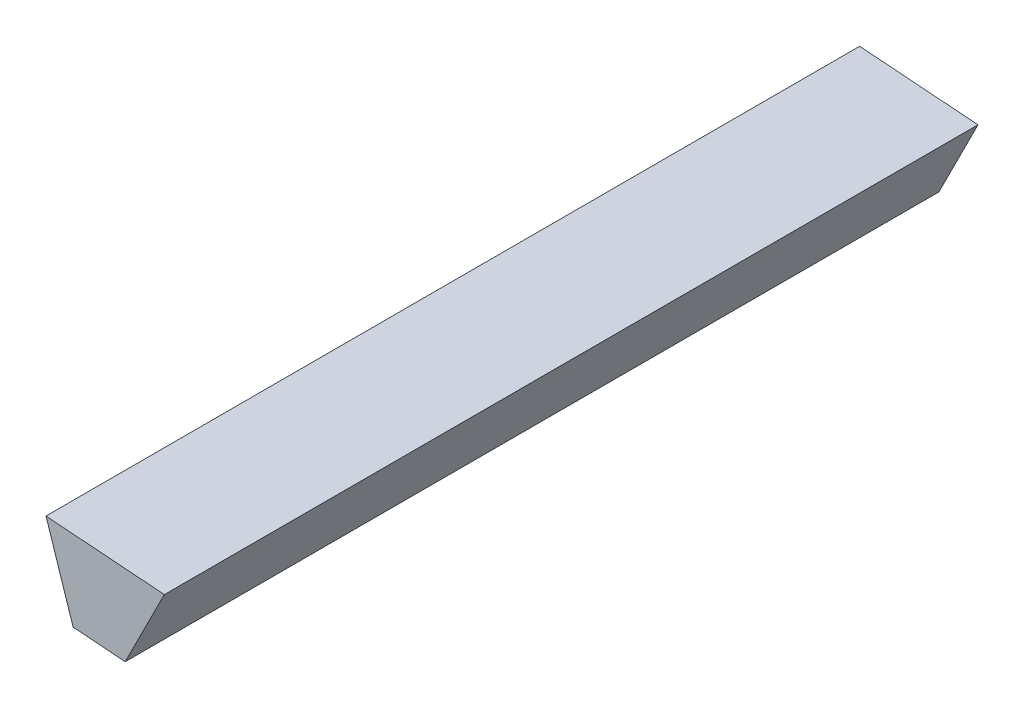
ISO-10303-21;
HEADER;
FILE_DESCRIPTION(('STEP AP214'),'2;1');
FILE_NAME('part.step','',(''),(''),'','','');
FILE_SCHEMA(('AUTOMOTIVE_DESIGN { 1 0 10303 214 1 1 1 1 }'));
ENDSEC;
DATA;
#1=APPLICATION_CONTEXT('core data for automotive mechanical design processes');
#2=APPLICATION_PROTOCOL_DEFINITION('international standard','automotive_design',2000,#1);
#3=PRODUCT_CONTEXT('',#1,'mechanical');
#4=PRODUCT('Part','Part','',(#3));
#5=PRODUCT_RELATED_PRODUCT_CATEGORY('part','',(#4));
#6=PRODUCT_DEFINITION_FORMATION('','',#4);
#7=PRODUCT_DEFINITION_CONTEXT('part definition',#1,'design');
#8=PRODUCT_DEFINITION('design','',#6,#7);
#9=PRODUCT_DEFINITION_SHAPE('','',#8);
#10=(LENGTH_UNIT() NAMED_UNIT(*) SI_UNIT(.MILLI.,.METRE.));
#11=(NAMED_UNIT(*) PLANE_ANGLE_UNIT() SI_UNIT($,.RADIAN.));
#12=(NAMED_UNIT(*) SI_UNIT($,.STERADIAN.) SOLID_ANGLE_UNIT());
#13=UNCERTAINTY_MEASURE_WITH_UNIT(LENGTH_MEASURE(1.E-05),#10,'distance_accuracy_value','');
#14=(GEOMETRIC_REPRESENTATION_CONTEXT(3) GLOBAL_UNCERTAINTY_ASSIGNED_CONTEXT((#13)) GLOBAL_UNIT_ASSIGNED_CONTEXT((#10,
#11,#12)) REPRESENTATION_CONTEXT('',''));
#15=CARTESIAN_POINT('',(0.,0.,0.));
#16=DIRECTION('',(0.,0.,1.));
#17=DIRECTION('',(1.,0.,0.));
#18=AXIS2_PLACEMENT_3D('',#15,#16,#17);
#19=CARTESIAN_POINT('',(3.,52.9150262212918,15.));
#20=DIRECTION('',(0.950206795615849,0.311620033960367,0.));
#21=DIRECTION('',(-0.311620033960367,0.950206795615849,0.));
#22=AXIS2_PLACEMENT_3D('',#19,#20,#21);
#23=PLANE('',#22);
#24=DIRECTION('',(0.311620033960367,-0.950206795615849,0.));
#25=VECTOR('',#24,1.);
#26=CARTESIAN_POINT('',(3.,52.9150262212918,-15.));
#27=LINE('',#26,#25);
#28=CARTESIAN_POINT('',(2.,55.9642743185329,-15.));
#29=VERTEX_POINT('',#28);
#30=CARTESIAN_POINT('',(3.,52.9150262212918,-15.));
#31=VERTEX_POINT('',#30);
#32=EDGE_CURVE('E107',#29,#31,#27,.T.);
#33=ORIENTED_EDGE('',*,*,#32,.T.);
#34=DIRECTION('',(0.,0.,-1.));
#35=VECTOR('',#34,1.);
#36=CARTESIAN_POINT('',(3.,52.9150262212918,15.));
#37=LINE('',#36,#35);
#38=CARTESIAN_POINT('',(3.,52.9150262212918,15.));
#39=VERTEX_POINT('',#38);
#40=EDGE_CURVE('E11',#39,#31,#37,.T.);
#41=ORIENTED_EDGE('',*,*,#40,.F.);
#42=DIRECTION('',(0.311620033960367,-0.950206795615849,0.));
#43=VECTOR('',#42,1.);
#44=CARTESIAN_POINT('',(3.,52.9150262212918,15.));
#45=LINE('',#44,#43);
#46=CARTESIAN_POINT('',(2.,55.9642743185329,15.));
#47=VERTEX_POINT('',#46);
#48=EDGE_CURVE('E91',#47,#39,#45,.T.);
#49=ORIENTED_EDGE('',*,*,#48,.F.);
#50=DIRECTION('',(0.,0.,-1.));
#51=VECTOR('',#50,1.);
#52=CARTESIAN_POINT('',(2.,55.9642743185329,15.));
#53=LINE('',#52,#51);
#54=EDGE_CURVE('E103',#47,#29,#53,.T.);
#55=ORIENTED_EDGE('',*,*,#54,.T.);
#56=EDGE_LOOP('',(#33,#41,#49,#55));
#57=FACE_BOUND('',#56,.T.);
#58=ADVANCED_FACE('F39',(#57),#23,.F.);
#59=CARTESIAN_POINT('',(4.92008294411766,52.7711358966528,15.));
#60=DIRECTION('',(0.0747300935864225,0.99720379718118,0.));
#61=DIRECTION('',(-0.99720379718118,0.0747300935864226,0.));
#62=AXIS2_PLACEMENT_3D('',#59,#60,#61);
#63=PLANE('',#62);
#64=DIRECTION('',(0.99720379718118,-0.0747300935864225,0.));
#65=VECTOR('',#64,1.);
#66=CARTESIAN_POINT('',(4.92008294411766,52.7711358966528,-15.));
#67=LINE('',#66,#65);
#68=CARTESIAN_POINT('',(4.92008294411766,52.7711358966528,-15.));
#69=VERTEX_POINT('',#68);
#70=EDGE_CURVE('E96',#31,#69,#67,.T.);
#71=ORIENTED_EDGE('',*,*,#70,.T.);
#72=DIRECTION('',(0.,0.,-1.));
#73=VECTOR('',#72,1.);
#74=CARTESIAN_POINT('',(4.92008294411766,52.7711358966528,15.));
#75=LINE('',#74,#73);
#76=CARTESIAN_POINT('',(4.92008294411766,52.7711358966528,15.));
#77=VERTEX_POINT('',#76);
#78=EDGE_CURVE('E48',#77,#69,#75,.T.);
#79=ORIENTED_EDGE('',*,*,#78,.F.);
#80=DIRECTION('',(0.99720379718118,-0.0747300935864225,0.));
#81=VECTOR('',#80,1.);
#82=CARTESIAN_POINT('',(4.92008294411766,52.7711358966528,15.));
#83=LINE('',#82,#81);
#84=EDGE_CURVE('E86',#39,#77,#83,.T.);
#85=ORIENTED_EDGE('',*,*,#84,.F.);
#86=ORIENTED_EDGE('',*,*,#40,.T.);
#87=EDGE_LOOP('',(#71,#79,#85,#86));
#88=FACE_BOUND('',#87,.T.);
#89=ADVANCED_FACE('F95',(#88),#63,.F.);
#90=CARTESIAN_POINT('',(6.36338061688898,55.637284145837,15.));
#91=DIRECTION('',(-0.893149214746202,0.44976046980392,0.));
#92=DIRECTION('',(-0.44976046980392,-0.893149214746202,0.));
#93=AXIS2_PLACEMENT_3D('',#90,#91,#92);
#94=PLANE('',#93);
#95=DIRECTION('',(0.44976046980392,0.893149214746202,0.));
#96=VECTOR('',#95,1.);
#97=CARTESIAN_POINT('',(6.36338061688898,55.637284145837,-15.));
#98=LINE('',#97,#96);
#99=CARTESIAN_POINT('',(6.36338061688898,55.637284145837,-15.));
#100=VERTEX_POINT('',#99);
#101=EDGE_CURVE('E73',#69,#100,#98,.T.);
#102=ORIENTED_EDGE('',*,*,#101,.T.);
#103=DIRECTION('',(0.,0.,-1.));
#104=VECTOR('',#103,1.);
#105=CARTESIAN_POINT('',(6.36338061688898,55.637284145837,15.));
#106=LINE('',#105,#104);
#107=CARTESIAN_POINT('',(6.36338061688898,55.637284145837,15.));
#108=VERTEX_POINT('',#107);
#109=EDGE_CURVE('E98',#108,#100,#106,.T.);
#110=ORIENTED_EDGE('',*,*,#109,.F.);
#111=DIRECTION('',(0.44976046980392,0.893149214746202,0.));
#112=VECTOR('',#111,1.);
#113=CARTESIAN_POINT('',(6.36338061688898,55.637284145837,15.));
#114=LINE('',#113,#112);
#115=EDGE_CURVE('E89',#77,#108,#114,.T.);
#116=ORIENTED_EDGE('',*,*,#115,.F.);
#117=ORIENTED_EDGE('',*,*,#78,.T.);
#118=EDGE_LOOP('',(#102,#110,#116,#117));
#119=FACE_BOUND('',#118,.T.);
#120=ADVANCED_FACE('F99',(#119),#94,.F.);
#121=CARTESIAN_POINT('',(2.,55.9642743185329,15.));
#122=DIRECTION('',(-0.0747300935864269,-0.99720379718118,0.));
#123=DIRECTION('',(0.99720379718118,-0.0747300935864269,0.));
#124=AXIS2_PLACEMENT_3D('',#121,#122,#123);
#125=PLANE('',#124);
#126=DIRECTION('',(-0.99720379718118,0.0747300935864269,0.));
#127=VECTOR('',#126,1.);
#128=CARTESIAN_POINT('',(2.,55.9642743185329,-15.));
#129=LINE('',#128,#127);
#130=EDGE_CURVE('E79',#100,#29,#129,.T.);
#131=ORIENTED_EDGE('',*,*,#130,.T.);
#132=ORIENTED_EDGE('',*,*,#54,.F.);
#133=DIRECTION('',(-0.99720379718118,0.0747300935864269,0.));
#134=VECTOR('',#133,1.);
#135=CARTESIAN_POINT('',(2.,55.9642743185329,15.));
#136=LINE('',#135,#134);
#137=EDGE_CURVE('E56',#108,#47,#136,.T.);
#138=ORIENTED_EDGE('',*,*,#137,.F.);
#139=ORIENTED_EDGE('',*,*,#109,.T.);
#140=EDGE_LOOP('',(#131,#132,#138,#139));
#141=FACE_BOUND('',#140,.T.);
#142=ADVANCED_FACE('F120',(#141),#125,.F.);
#143=CARTESIAN_POINT('',(0.,0.,15.));
#144=DIRECTION('',(0.,0.,-1.));
#145=DIRECTION('',(-1.,0.,0.));
#146=AXIS2_PLACEMENT_3D('',#143,#144,#145);
#147=PLANE('',#146);
#148=ORIENTED_EDGE('',*,*,#48,.T.);
#149=ORIENTED_EDGE('',*,*,#84,.T.);
#150=ORIENTED_EDGE('',*,*,#115,.T.);
#151=ORIENTED_EDGE('',*,*,#137,.T.);
#152=EDGE_LOOP('',(#148,#149,#150,#151));
#153=FACE_BOUND('',#152,.T.);
#154=ADVANCED_FACE('F87',(#153),#147,.F.);
#155=CARTESIAN_POINT('',(0.,0.,-15.));
#156=DIRECTION('',(0.,0.,-1.));
#157=DIRECTION('',(-1.,0.,0.));
#158=AXIS2_PLACEMENT_3D('',#155,#156,#157);
#159=PLANE('',#158);
#160=ORIENTED_EDGE('',*,*,#32,.F.);
#161=ORIENTED_EDGE('',*,*,#130,.F.);
#162=ORIENTED_EDGE('',*,*,#101,.F.);
#163=ORIENTED_EDGE('',*,*,#70,.F.);
#164=EDGE_LOOP('',(#160,#161,#162,#163));
#165=FACE_BOUND('',#164,.T.);
#166=ADVANCED_FACE('F123',(#165),#159,.T.);
#167=CLOSED_SHELL('',(#58,#89,#120,#142,#154,#166));
#168=MANIFOLD_SOLID_BREP('B2',#167);
#169=ADVANCED_BREP_SHAPE_REPRESENTATION('',(#18,#168),#14);
#170=SHAPE_DEFINITION_REPRESENTATION(#9,#169);
ENDSEC;
END-ISO-10303-21;
